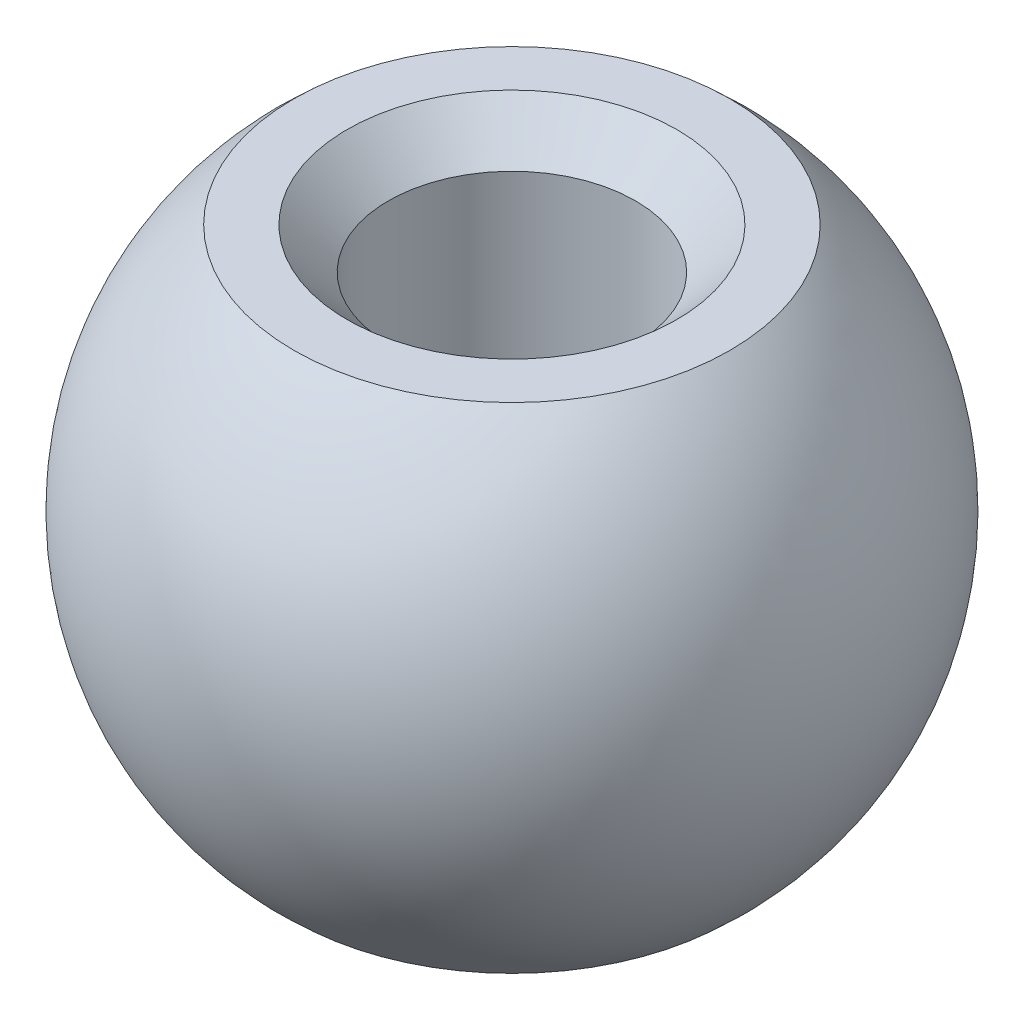
ISO-10303-21;
HEADER;
FILE_DESCRIPTION(('STEP AP214'),'2;1');
FILE_NAME('part.step','',(''),(''),'','','');
FILE_SCHEMA(('AUTOMOTIVE_DESIGN { 1 0 10303 214 1 1 1 1 }'));
ENDSEC;
DATA;
#1=APPLICATION_CONTEXT('core data for automotive mechanical design processes');
#2=APPLICATION_PROTOCOL_DEFINITION('international standard','automotive_design',2000,#1);
#3=PRODUCT_CONTEXT('',#1,'mechanical');
#4=PRODUCT('Part','Part','',(#3));
#5=PRODUCT_RELATED_PRODUCT_CATEGORY('part','',(#4));
#6=PRODUCT_DEFINITION_FORMATION('','',#4);
#7=PRODUCT_DEFINITION_CONTEXT('part definition',#1,'design');
#8=PRODUCT_DEFINITION('design','',#6,#7);
#9=PRODUCT_DEFINITION_SHAPE('','',#8);
#10=(LENGTH_UNIT() NAMED_UNIT(*) SI_UNIT(.MILLI.,.METRE.));
#11=(NAMED_UNIT(*) PLANE_ANGLE_UNIT() SI_UNIT($,.RADIAN.));
#12=(NAMED_UNIT(*) SI_UNIT($,.STERADIAN.) SOLID_ANGLE_UNIT());
#13=UNCERTAINTY_MEASURE_WITH_UNIT(LENGTH_MEASURE(1.E-05),#10,'distance_accuracy_value','');
#14=(GEOMETRIC_REPRESENTATION_CONTEXT(3) GLOBAL_UNCERTAINTY_ASSIGNED_CONTEXT((#13)) GLOBAL_UNIT_ASSIGNED_CONTEXT((#10,
#11,#12)) REPRESENTATION_CONTEXT('',''));
#15=CARTESIAN_POINT('',(0.,0.,0.));
#16=DIRECTION('',(0.,0.,1.));
#17=DIRECTION('',(1.,0.,0.));
#18=AXIS2_PLACEMENT_3D('',#15,#16,#17);
#19=CARTESIAN_POINT('',(0.,0.,0.));
#20=DIRECTION('',(0.,1.,0.));
#21=DIRECTION('',(1.,0.,0.));
#22=AXIS2_PLACEMENT_3D('',#19,#20,#21);
#23=SPHERICAL_SURFACE('',#22,4.);
#24=CARTESIAN_POINT('',(0.,-3.,0.));
#25=DIRECTION('',(0.,1.,0.));
#26=DIRECTION('',(0.,0.,1.));
#27=AXIS2_PLACEMENT_3D('',#24,#25,#26);
#28=CIRCLE('',#27,2.64575131106459);
#29=CARTESIAN_POINT('',(2.64575131106459,-3.,0.));
#30=VERTEX_POINT('',#29);
#31=EDGE_CURVE('E52',#30,#30,#28,.T.);
#32=CARTESIAN_POINT('',(0.,3.,0.));
#33=DIRECTION('',(0.,-1.,0.));
#34=DIRECTION('',(0.,0.,-1.));
#35=AXIS2_PLACEMENT_3D('',#32,#33,#34);
#36=CIRCLE('',#35,2.64575131106459);
#37=CARTESIAN_POINT('',(2.64575131106459,3.,0.));
#38=VERTEX_POINT('',#37);
#39=EDGE_CURVE('E55',#38,#38,#36,.T.);
#40=CARTESIAN_POINT('',(2.64575131106459,-3.,0.));
#41=CARTESIAN_POINT('',(2.69875651187134,-2.95325632278245,0.));
#42=CARTESIAN_POINT('',(2.75052029684331,-2.90510527447021,0.));
#43=CARTESIAN_POINT('',(2.85142545255604,-2.80612960257577,0.));
#44=CARTESIAN_POINT('',(2.90056682329681,-2.75530497899356,0.));
#45=CARTESIAN_POINT('',(2.99608756798547,-2.65112332347855,0.));
#46=CARTESIAN_POINT('',(3.04246694193337,-2.59776629154575,0.));
#47=CARTESIAN_POINT('',(3.13233384188064,-2.48867011130152,0.));
#48=CARTESIAN_POINT('',(3.17582136788002,-2.4329309629901,0.));
#49=CARTESIAN_POINT('',(3.2597823144284,-2.31922699358693,0.));
#50=CARTESIAN_POINT('',(3.3002557349774,-2.26126217249517,0.));
#51=CARTESIAN_POINT('',(3.37807482070356,-2.14326969696134,0.));
#52=CARTESIAN_POINT('',(3.41542048588072,-2.08324204251927,0.));
#53=CARTESIAN_POINT('',(3.48687915806733,-1.9612924949961,0.));
#54=CARTESIAN_POINT('',(3.52099216507678,-1.89937060191501,0.));
#55=CARTESIAN_POINT('',(3.58588970804608,-1.77380650264688,0.));
#56=CARTESIAN_POINT('',(3.61667424400594,-1.71016429645984,0.));
#57=CARTESIAN_POINT('',(3.67482837812324,-1.58133832566934,0.));
#58=CARTESIAN_POINT('',(3.70219797628069,-1.51615456106587,0.));
#59=CARTESIAN_POINT('',(3.75344536048972,-1.38442855873451,0.));
#60=CARTESIAN_POINT('',(3.7773231465413,-1.3178863210066,0.));
#61=CARTESIAN_POINT('',(3.82151983967928,-1.18363027313511,0.));
#62=CARTESIAN_POINT('',(3.84183874676568,-1.11591646299151,0.));
#63=CARTESIAN_POINT('',(3.87886061118061,-0.97950746170912,0.));
#64=CARTESIAN_POINT('',(3.89556356850914,-0.910812270570316,0.));
#65=CARTESIAN_POINT('',(3.92530661891354,-0.77263345516107,0.));
#66=CARTESIAN_POINT('',(3.93834671198941,-0.703149830890627,0.));
#67=CARTESIAN_POINT('',(3.96072740748069,-0.563589311599921,0.));
#68=CARTESIAN_POINT('',(3.9700680098961,-0.493512416579659,0.));
#69=CARTESIAN_POINT('',(3.98502348861544,-0.352962184521471,0.));
#70=CARTESIAN_POINT('',(3.99063836491936,-0.282488847483545,0.));
#71=CARTESIAN_POINT('',(3.99812662061164,-0.141343673630413,0.));
#72=CARTESIAN_POINT('',(4.,-0.0706718368152065,0.));
#73=CARTESIAN_POINT('',(4.,0.0706718368152065,0.));
#74=CARTESIAN_POINT('',(3.99812662061164,0.141343673630413,0.));
#75=CARTESIAN_POINT('',(3.99063836491936,0.282488847483545,0.));
#76=CARTESIAN_POINT('',(3.98502348861544,0.352962184521471,0.));
#77=CARTESIAN_POINT('',(3.9700680098961,0.493512416579659,0.));
#78=CARTESIAN_POINT('',(3.96072740748069,0.563589311599922,0.));
#79=CARTESIAN_POINT('',(3.93834671198941,0.703149830890628,0.));
#80=CARTESIAN_POINT('',(3.92530661891354,0.772633455161071,0.));
#81=CARTESIAN_POINT('',(3.89556356850913,0.910812270570317,0.));
#82=CARTESIAN_POINT('',(3.87886061118061,0.979507461709119,0.));
#83=CARTESIAN_POINT('',(3.84183874676568,1.11591646299151,0.));
#84=CARTESIAN_POINT('',(3.82151983967928,1.18363027313511,0.));
#85=CARTESIAN_POINT('',(3.7773231465413,1.3178863210066,0.));
#86=CARTESIAN_POINT('',(3.75344536048972,1.38442855873451,0.));
#87=CARTESIAN_POINT('',(3.70219797628069,1.51615456106587,0.));
#88=CARTESIAN_POINT('',(3.67482837812324,1.58133832566934,0.));
#89=CARTESIAN_POINT('',(3.61667424400594,1.71016429645984,0.));
#90=CARTESIAN_POINT('',(3.58588970804608,1.77380650264688,0.));
#91=CARTESIAN_POINT('',(3.52099216507678,1.89937060191501,0.));
#92=CARTESIAN_POINT('',(3.48687915806733,1.9612924949961,0.));
#93=CARTESIAN_POINT('',(3.41542048588072,2.08324204251927,0.));
#94=CARTESIAN_POINT('',(3.37807482070356,2.14326969696134,0.));
#95=CARTESIAN_POINT('',(3.3002557349774,2.26126217249517,0.));
#96=CARTESIAN_POINT('',(3.2597823144284,2.31922699358693,0.));
#97=CARTESIAN_POINT('',(3.17582136788002,2.4329309629901,0.));
#98=CARTESIAN_POINT('',(3.13233384188064,2.48867011130152,0.));
#99=CARTESIAN_POINT('',(3.04246694193337,2.59776629154575,0.));
#100=CARTESIAN_POINT('',(2.99608756798547,2.65112332347855,0.));
#101=CARTESIAN_POINT('',(2.90056682329681,2.75530497899356,0.));
#102=CARTESIAN_POINT('',(2.85142545255604,2.80612960257577,0.));
#103=CARTESIAN_POINT('',(2.75052029684331,2.90510527447022,0.));
#104=CARTESIAN_POINT('',(2.69875651187134,2.95325632278245,0.));
#105=CARTESIAN_POINT('',(2.64575131106459,3.,0.));
#106=B_SPLINE_CURVE_WITH_KNOTS('',3,(#40,#41,#42,#43,#44,#45,#46,#47,#48,#49,#50,#51,#52,#53,
#54,#55,#56,#57,#58,#59,#60,#61,#62,#63,#64,#65,#66,#67,#68,#69,#70,#71,#72,#73,#74,#75,#76,#77,
#78,#79,#80,#81,#82,#83,#84,#85,#86,#87,#88,#89,#90,#91,#92,#93,#94,#95,#96,#97,#98,#99,#100,
#101,#102,#103,#104,#105),.UNSPECIFIED.,.F.,.F.,(4,2,2,2,2,2,2,2,2,2,2,2,2,2,2,2,2,2,2,2,2,2,2,
2,2,2,2,2,2,2,2,2,4),(0.,0.211990702333812,0.423981404667625,0.635972107001437,
0.847962809335249,1.05995351166906,1.27194421400287,1.48393491633669,1.6959256186705,
1.90791632100431,2.11990702333812,2.33189772567194,2.54388842800575,2.75587913033956,
2.96786983267337,3.17986053500719,3.391851237341,3.60384193967481,3.81583264200862,
4.02782334434244,4.23981404667625,4.45180474901006,4.66379545134387,4.87578615367768,
5.0877768560115,5.29976755834531,5.51175826067912,5.72374896301293,5.93573966534674,
6.14773036768056,6.35972107001437,6.57171177234818,6.78370247468199),.UNSPECIFIED.);
#107=EDGE_CURVE('BSEAM32',#30,#38,#106,.T.);
#108=ORIENTED_EDGE('',*,*,#31,.T.);
#109=ORIENTED_EDGE('',*,*,#39,.T.);
#110=ORIENTED_EDGE('',*,*,#107,.T.);
#111=ORIENTED_EDGE('',*,*,#107,.F.);
#112=EDGE_LOOP('',(#108,#110,#109,#111));
#113=FACE_BOUND('',#112,.T.);
#114=ADVANCED_FACE('F32',(#113),#23,.T.);
#115=CARTESIAN_POINT('',(-5.,3.,2.64575131106459));
#116=DIRECTION('',(0.,-1.,0.));
#117=DIRECTION('',(0.,0.,-1.));
#118=AXIS2_PLACEMENT_3D('',#115,#116,#117);
#119=PLANE('',#118);
#120=CARTESIAN_POINT('',(0.,3.,0.));
#121=DIRECTION('',(0.,-1.,0.));
#122=DIRECTION('',(0.,0.,-1.));
#123=AXIS2_PLACEMENT_3D('',#120,#121,#122);
#124=CIRCLE('',#123,2.);
#125=CARTESIAN_POINT('',(0.,3.,-2.));
#126=VERTEX_POINT('',#125);
#127=EDGE_CURVE('E47',#126,#126,#124,.T.);
#128=ORIENTED_EDGE('',*,*,#127,.T.);
#129=EDGE_LOOP('',(#128));
#130=FACE_BOUND('',#129,.T.);
#131=ORIENTED_EDGE('',*,*,#39,.F.);
#132=EDGE_LOOP('',(#131));
#133=FACE_BOUND('',#132,.T.);
#134=ADVANCED_FACE('F60',(#130,#133),#119,.F.);
#135=CARTESIAN_POINT('',(-5.,-3.,2.64575131106459));
#136=DIRECTION('',(0.,1.,0.));
#137=DIRECTION('',(0.,0.,1.));
#138=AXIS2_PLACEMENT_3D('',#135,#136,#137);
#139=PLANE('',#138);
#140=CARTESIAN_POINT('',(0.,-3.,0.));
#141=DIRECTION('',(0.,1.,0.));
#142=DIRECTION('',(0.,0.,1.));
#143=AXIS2_PLACEMENT_3D('',#140,#141,#142);
#144=CIRCLE('',#143,2.);
#145=CARTESIAN_POINT('',(0.,-3.,2.));
#146=VERTEX_POINT('',#145);
#147=EDGE_CURVE('E10',#146,#146,#144,.T.);
#148=ORIENTED_EDGE('',*,*,#147,.T.);
#149=EDGE_LOOP('',(#148));
#150=FACE_BOUND('',#149,.T.);
#151=ORIENTED_EDGE('',*,*,#31,.F.);
#152=EDGE_LOOP('',(#151));
#153=FACE_BOUND('',#152,.T.);
#154=ADVANCED_FACE('F62',(#150,#153),#139,.F.);
#155=CARTESIAN_POINT('',(0.,7.,0.));
#156=DIRECTION('',(0.,-1.,0.));
#157=DIRECTION('',(0.,0.,-1.));
#158=AXIS2_PLACEMENT_3D('',#155,#156,#157);
#159=CYLINDRICAL_SURFACE('',#158,1.5);
#160=CARTESIAN_POINT('',(0.,2.5,0.));
#161=DIRECTION('',(0.,-1.,0.));
#162=DIRECTION('',(0.,0.,-1.));
#163=AXIS2_PLACEMENT_3D('',#160,#161,#162);
#164=CIRCLE('',#163,1.5);
#165=CARTESIAN_POINT('',(0.,2.5,-1.5));
#166=VERTEX_POINT('',#165);
#167=EDGE_CURVE('E39',#166,#166,#164,.F.);
#168=ORIENTED_EDGE('',*,*,#167,.T.);
#169=EDGE_LOOP('',(#168));
#170=FACE_BOUND('',#169,.T.);
#171=CARTESIAN_POINT('',(0.,-2.5,0.));
#172=DIRECTION('',(0.,1.,0.));
#173=DIRECTION('',(0.,0.,1.));
#174=AXIS2_PLACEMENT_3D('',#171,#172,#173);
#175=CIRCLE('',#174,1.5);
#176=CARTESIAN_POINT('',(0.,-2.5,1.5));
#177=VERTEX_POINT('',#176);
#178=EDGE_CURVE('E43',#177,#177,#175,.F.);
#179=ORIENTED_EDGE('',*,*,#178,.T.);
#180=EDGE_LOOP('',(#179));
#181=FACE_BOUND('',#180,.T.);
#182=ADVANCED_FACE('F69',(#170,#181),#159,.F.);
#183=CARTESIAN_POINT('',(0.,3.,0.));
#184=DIRECTION('',(0.,1.,0.));
#185=DIRECTION('',(0.,0.,1.));
#186=AXIS2_PLACEMENT_3D('',#183,#184,#185);
#187=CONICAL_SURFACE('',#186,2.,0.785398163397447);
#188=ORIENTED_EDGE('',*,*,#167,.F.);
#189=EDGE_LOOP('',(#188));
#190=FACE_BOUND('',#189,.T.);
#191=ORIENTED_EDGE('',*,*,#127,.F.);
#192=EDGE_LOOP('',(#191));
#193=FACE_BOUND('',#192,.T.);
#194=ADVANCED_FACE('F74',(#190,#193),#187,.F.);
#195=CARTESIAN_POINT('',(0.,-2.5,0.));
#196=DIRECTION('',(0.,-1.,0.));
#197=DIRECTION('',(0.,0.,-1.));
#198=AXIS2_PLACEMENT_3D('',#195,#196,#197);
#199=CONICAL_SURFACE('',#198,1.5,0.785398163397451);
#200=ORIENTED_EDGE('',*,*,#147,.F.);
#201=EDGE_LOOP('',(#200));
#202=FACE_BOUND('',#201,.T.);
#203=ORIENTED_EDGE('',*,*,#178,.F.);
#204=EDGE_LOOP('',(#203));
#205=FACE_BOUND('',#204,.T.);
#206=ADVANCED_FACE('F34',(#202,#205),#199,.F.);
#207=CLOSED_SHELL('',(#114,#134,#154,#182,#194,#206));
#208=MANIFOLD_SOLID_BREP('B2',#207);
#209=ADVANCED_BREP_SHAPE_REPRESENTATION('',(#18,#208),#14);
#210=SHAPE_DEFINITION_REPRESENTATION(#9,#209);
ENDSEC;
END-ISO-10303-21;
